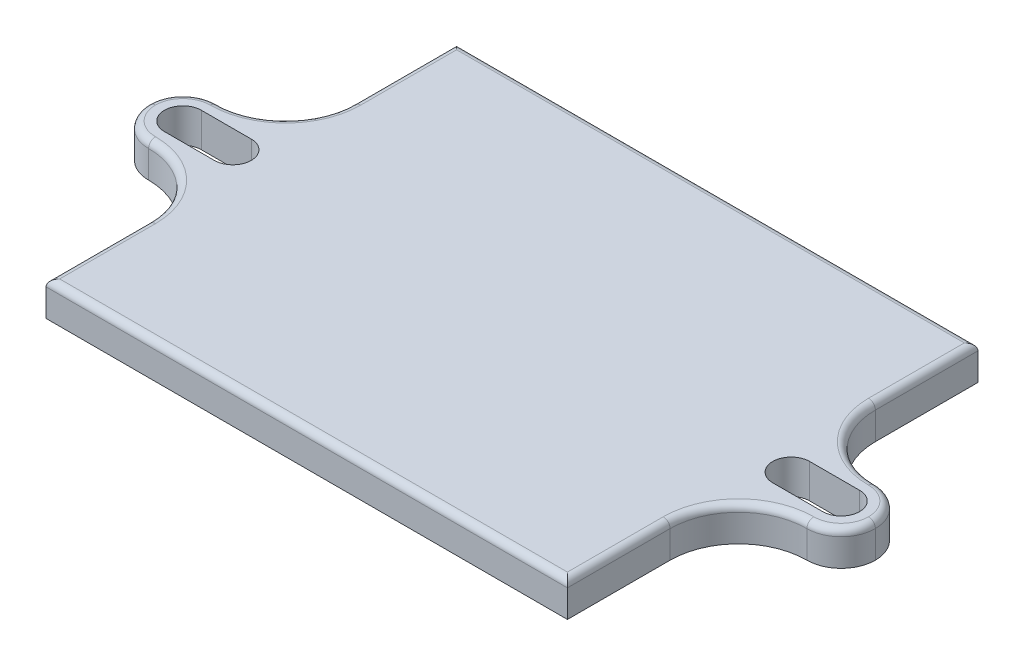
ISO-10303-21;
HEADER;
FILE_DESCRIPTION(('STEP AP214'),'2;1');
FILE_NAME('part.step','',(''),(''),'','','');
FILE_SCHEMA(('AUTOMOTIVE_DESIGN { 1 0 10303 214 1 1 1 1 }'));
ENDSEC;
DATA;
#1=APPLICATION_CONTEXT('core data for automotive mechanical design processes');
#2=APPLICATION_PROTOCOL_DEFINITION('international standard','automotive_design',2000,#1);
#3=PRODUCT_CONTEXT('',#1,'mechanical');
#4=PRODUCT('Part','Part','',(#3));
#5=PRODUCT_RELATED_PRODUCT_CATEGORY('part','',(#4));
#6=PRODUCT_DEFINITION_FORMATION('','',#4);
#7=PRODUCT_DEFINITION_CONTEXT('part definition',#1,'design');
#8=PRODUCT_DEFINITION('design','',#6,#7);
#9=PRODUCT_DEFINITION_SHAPE('','',#8);
#10=(LENGTH_UNIT() NAMED_UNIT(*) SI_UNIT(.MILLI.,.METRE.));
#11=(NAMED_UNIT(*) PLANE_ANGLE_UNIT() SI_UNIT($,.RADIAN.));
#12=(NAMED_UNIT(*) SI_UNIT($,.STERADIAN.) SOLID_ANGLE_UNIT());
#13=UNCERTAINTY_MEASURE_WITH_UNIT(LENGTH_MEASURE(1.E-05),#10,'distance_accuracy_value','');
#14=(GEOMETRIC_REPRESENTATION_CONTEXT(3) GLOBAL_UNCERTAINTY_ASSIGNED_CONTEXT((#13)) GLOBAL_UNIT_ASSIGNED_CONTEXT((#10,
#11,#12)) REPRESENTATION_CONTEXT('',''));
#15=CARTESIAN_POINT('',(0.,0.,0.));
#16=DIRECTION('',(0.,0.,1.));
#17=DIRECTION('',(1.,0.,0.));
#18=AXIS2_PLACEMENT_3D('',#15,#16,#17);
#19=CARTESIAN_POINT('',(0.,2.5,0.));
#20=DIRECTION('',(0.,1.,0.));
#21=DIRECTION('',(0.,0.,1.));
#22=AXIS2_PLACEMENT_3D('',#19,#20,#21);
#23=PLANE('',#22);
#24=DIRECTION('',(0.,0.,-1.));
#25=VECTOR('',#24,1.);
#26=CARTESIAN_POINT('',(37.1,2.5,15.));
#27=LINE('',#26,#25);
#28=CARTESIAN_POINT('',(37.1,2.5,29.));
#29=VERTEX_POINT('',#28);
#30=CARTESIAN_POINT('',(37.1,2.5,15.));
#31=VERTEX_POINT('',#30);
#32=EDGE_CURVE('E381',#29,#31,#27,.T.);
#33=ORIENTED_EDGE('',*,*,#32,.T.);
#34=CARTESIAN_POINT('',(48.1,2.5,15.));
#35=DIRECTION('',(0.,1.,0.));
#36=DIRECTION('',(0.,0.,1.));
#37=AXIS2_PLACEMENT_3D('',#34,#35,#36);
#38=CIRCLE('',#37,11.);
#39=CARTESIAN_POINT('',(48.1,2.5,4.));
#40=VERTEX_POINT('',#39);
#41=EDGE_CURVE('E394',#31,#40,#38,.F.);
#42=ORIENTED_EDGE('',*,*,#41,.T.);
#43=CARTESIAN_POINT('',(48.1,2.5,0.));
#44=DIRECTION('',(0.,1.,0.));
#45=DIRECTION('',(0.,0.,1.));
#46=AXIS2_PLACEMENT_3D('',#43,#44,#45);
#47=CIRCLE('',#46,4.);
#48=CARTESIAN_POINT('',(52.1,2.5,0.));
#49=VERTEX_POINT('',#48);
#50=EDGE_CURVE('E392',#40,#49,#47,.T.);
#51=ORIENTED_EDGE('',*,*,#50,.T.);
#52=CARTESIAN_POINT('',(48.1,2.5,0.));
#53=DIRECTION('',(0.,1.,0.));
#54=DIRECTION('',(0.,0.,1.));
#55=AXIS2_PLACEMENT_3D('',#52,#53,#54);
#56=CIRCLE('',#55,4.);
#57=CARTESIAN_POINT('',(48.1,2.5,-4.));
#58=VERTEX_POINT('',#57);
#59=EDGE_CURVE('E390',#49,#58,#56,.T.);
#60=ORIENTED_EDGE('',*,*,#59,.T.);
#61=CARTESIAN_POINT('',(48.1,2.5,-15.));
#62=DIRECTION('',(0.,1.,0.));
#63=DIRECTION('',(0.,0.,1.));
#64=AXIS2_PLACEMENT_3D('',#61,#62,#63);
#65=CIRCLE('',#64,11.);
#66=CARTESIAN_POINT('',(37.1,2.5,-15.));
#67=VERTEX_POINT('',#66);
#68=EDGE_CURVE('E388',#58,#67,#65,.F.);
#69=ORIENTED_EDGE('',*,*,#68,.T.);
#70=DIRECTION('',(0.,0.,-1.));
#71=VECTOR('',#70,1.);
#72=CARTESIAN_POINT('',(37.1,2.5,-30.));
#73=LINE('',#72,#71);
#74=CARTESIAN_POINT('',(37.1,2.5,-29.));
#75=VERTEX_POINT('',#74);
#76=EDGE_CURVE('E386',#67,#75,#73,.T.);
#77=ORIENTED_EDGE('',*,*,#76,.T.);
#78=DIRECTION('',(-1.,0.,0.));
#79=VECTOR('',#78,1.);
#80=CARTESIAN_POINT('',(-38.1,2.5,-29.));
#81=LINE('',#80,#79);
#82=CARTESIAN_POINT('',(-37.1,2.5,-29.));
#83=VERTEX_POINT('',#82);
#84=EDGE_CURVE('E384',#75,#83,#81,.T.);
#85=ORIENTED_EDGE('',*,*,#84,.T.);
#86=DIRECTION('',(0.,0.,1.));
#87=VECTOR('',#86,1.);
#88=CARTESIAN_POINT('',(-37.1,2.5,-15.));
#89=LINE('',#88,#87);
#90=CARTESIAN_POINT('',(-37.1,2.5,-15.));
#91=VERTEX_POINT('',#90);
#92=EDGE_CURVE('E379',#83,#91,#89,.T.);
#93=ORIENTED_EDGE('',*,*,#92,.T.);
#94=CARTESIAN_POINT('',(-48.1,2.5,-15.));
#95=DIRECTION('',(0.,1.,0.));
#96=DIRECTION('',(0.,0.,1.));
#97=AXIS2_PLACEMENT_3D('',#94,#95,#96);
#98=CIRCLE('',#97,11.);
#99=CARTESIAN_POINT('',(-48.1,2.5,-4.));
#100=VERTEX_POINT('',#99);
#101=EDGE_CURVE('E377',#91,#100,#98,.F.);
#102=ORIENTED_EDGE('',*,*,#101,.T.);
#103=CARTESIAN_POINT('',(-48.1,2.5,0.));
#104=DIRECTION('',(0.,1.,0.));
#105=DIRECTION('',(0.,0.,1.));
#106=AXIS2_PLACEMENT_3D('',#103,#104,#105);
#107=CIRCLE('',#106,4.);
#108=CARTESIAN_POINT('',(-52.1,2.5,0.));
#109=VERTEX_POINT('',#108);
#110=EDGE_CURVE('E375',#100,#109,#107,.T.);
#111=ORIENTED_EDGE('',*,*,#110,.T.);
#112=CARTESIAN_POINT('',(-48.1,2.5,0.));
#113=DIRECTION('',(0.,1.,0.));
#114=DIRECTION('',(0.,0.,1.));
#115=AXIS2_PLACEMENT_3D('',#112,#113,#114);
#116=CIRCLE('',#115,4.);
#117=CARTESIAN_POINT('',(-48.1,2.5,4.));
#118=VERTEX_POINT('',#117);
#119=EDGE_CURVE('E373',#109,#118,#116,.T.);
#120=ORIENTED_EDGE('',*,*,#119,.T.);
#121=CARTESIAN_POINT('',(-48.1,2.5,15.));
#122=DIRECTION('',(0.,1.,0.));
#123=DIRECTION('',(0.,0.,1.));
#124=AXIS2_PLACEMENT_3D('',#121,#122,#123);
#125=CIRCLE('',#124,11.);
#126=CARTESIAN_POINT('',(-37.1,2.5,15.));
#127=VERTEX_POINT('',#126);
#128=EDGE_CURVE('E371',#118,#127,#125,.F.);
#129=ORIENTED_EDGE('',*,*,#128,.T.);
#130=DIRECTION('',(0.,0.,1.));
#131=VECTOR('',#130,1.);
#132=CARTESIAN_POINT('',(-37.1,2.5,30.));
#133=LINE('',#132,#131);
#134=CARTESIAN_POINT('',(-37.1,2.5,29.));
#135=VERTEX_POINT('',#134);
#136=EDGE_CURVE('E369',#127,#135,#133,.T.);
#137=ORIENTED_EDGE('',*,*,#136,.T.);
#138=DIRECTION('',(1.,0.,0.));
#139=VECTOR('',#138,1.);
#140=CARTESIAN_POINT('',(38.1,2.5,29.));
#141=LINE('',#140,#139);
#142=EDGE_CURVE('E362',#135,#29,#141,.T.);
#143=ORIENTED_EDGE('',*,*,#142,.T.);
#144=EDGE_LOOP('',(#33,#42,#51,#60,#69,#77,#85,#93,#102,#111,#120,#129,#137,#143));
#145=FACE_BOUND('',#144,.T.);
#146=CARTESIAN_POINT('',(-48.1,2.5,0.));
#147=DIRECTION('',(0.,1.,0.));
#148=DIRECTION('',(0.,0.,1.));
#149=AXIS2_PLACEMENT_3D('',#146,#147,#148);
#150=CIRCLE('',#149,2.7);
#151=CARTESIAN_POINT('',(-48.1,2.5,-2.7));
#152=VERTEX_POINT('',#151);
#153=CARTESIAN_POINT('',(-48.1,2.5,2.7));
#154=VERTEX_POINT('',#153);
#155=EDGE_CURVE('E259',#152,#154,#150,.T.);
#156=ORIENTED_EDGE('',*,*,#155,.F.);
#157=DIRECTION('',(-1.,0.,0.));
#158=VECTOR('',#157,1.);
#159=CARTESIAN_POINT('',(-48.1,2.5,-2.7));
#160=LINE('',#159,#158);
#161=CARTESIAN_POINT('',(-40.8,2.5,-2.7));
#162=VERTEX_POINT('',#161);
#163=EDGE_CURVE('E269',#162,#152,#160,.T.);
#164=ORIENTED_EDGE('',*,*,#163,.F.);
#165=CARTESIAN_POINT('',(-40.8,2.5,0.));
#166=DIRECTION('',(0.,1.,0.));
#167=DIRECTION('',(0.,0.,-1.));
#168=AXIS2_PLACEMENT_3D('',#165,#166,#167);
#169=CIRCLE('',#168,2.7);
#170=CARTESIAN_POINT('',(-40.8,2.5,2.7));
#171=VERTEX_POINT('',#170);
#172=EDGE_CURVE('E266',#171,#162,#169,.T.);
#173=ORIENTED_EDGE('',*,*,#172,.F.);
#174=DIRECTION('',(1.,0.,0.));
#175=VECTOR('',#174,1.);
#176=CARTESIAN_POINT('',(-48.1,2.5,2.7));
#177=LINE('',#176,#175);
#178=EDGE_CURVE('E263',#154,#171,#177,.T.);
#179=ORIENTED_EDGE('',*,*,#178,.F.);
#180=EDGE_LOOP('',(#156,#164,#173,#179));
#181=FACE_BOUND('',#180,.T.);
#182=DIRECTION('',(1.,0.,0.));
#183=VECTOR('',#182,1.);
#184=CARTESIAN_POINT('',(48.1,2.5,-2.7));
#185=LINE('',#184,#183);
#186=CARTESIAN_POINT('',(40.8,2.5,-2.7));
#187=VERTEX_POINT('',#186);
#188=CARTESIAN_POINT('',(48.1,2.5,-2.7));
#189=VERTEX_POINT('',#188);
#190=EDGE_CURVE('E244',#187,#189,#185,.T.);
#191=ORIENTED_EDGE('',*,*,#190,.T.);
#192=CARTESIAN_POINT('',(48.1,2.5,0.));
#193=DIRECTION('',(0.,-1.,0.));
#194=DIRECTION('',(0.,0.,1.));
#195=AXIS2_PLACEMENT_3D('',#192,#193,#194);
#196=CIRCLE('',#195,2.7);
#197=CARTESIAN_POINT('',(48.1,2.5,2.7));
#198=VERTEX_POINT('',#197);
#199=EDGE_CURVE('E249',#189,#198,#196,.T.);
#200=ORIENTED_EDGE('',*,*,#199,.T.);
#201=DIRECTION('',(-1.,0.,0.));
#202=VECTOR('',#201,1.);
#203=CARTESIAN_POINT('',(48.1,2.5,2.7));
#204=LINE('',#203,#202);
#205=CARTESIAN_POINT('',(40.8,2.5,2.7));
#206=VERTEX_POINT('',#205);
#207=EDGE_CURVE('E252',#198,#206,#204,.T.);
#208=ORIENTED_EDGE('',*,*,#207,.T.);
#209=CARTESIAN_POINT('',(40.8,2.5,0.));
#210=DIRECTION('',(0.,-1.,0.));
#211=DIRECTION('',(0.,0.,-1.));
#212=AXIS2_PLACEMENT_3D('',#209,#210,#211);
#213=CIRCLE('',#212,2.7);
#214=EDGE_CURVE('E233',#206,#187,#213,.T.);
#215=ORIENTED_EDGE('',*,*,#214,.T.);
#216=EDGE_LOOP('',(#191,#200,#208,#215));
#217=FACE_BOUND('',#216,.T.);
#218=ADVANCED_FACE('F35',(#145,#181,#217),#23,.T.);
#219=CARTESIAN_POINT('',(0.,-2.5,0.));
#220=DIRECTION('',(0.,1.,0.));
#221=DIRECTION('',(0.,0.,1.));
#222=AXIS2_PLACEMENT_3D('',#219,#220,#221);
#223=PLANE('',#222);
#224=CARTESIAN_POINT('',(48.1,-2.5,-15.));
#225=DIRECTION('',(0.,1.,0.));
#226=DIRECTION('',(0.,0.,1.));
#227=AXIS2_PLACEMENT_3D('',#224,#225,#226);
#228=CIRCLE('',#227,10.);
#229=CARTESIAN_POINT('',(38.1,-2.5,-15.));
#230=VERTEX_POINT('',#229);
#231=CARTESIAN_POINT('',(48.1,-2.5,-5.));
#232=VERTEX_POINT('',#231);
#233=EDGE_CURVE('E342',#230,#232,#228,.T.);
#234=ORIENTED_EDGE('',*,*,#233,.T.);
#235=CARTESIAN_POINT('',(48.1,-2.5,0.));
#236=DIRECTION('',(0.,1.,0.));
#237=DIRECTION('',(0.,0.,1.));
#238=AXIS2_PLACEMENT_3D('',#235,#236,#237);
#239=CIRCLE('',#238,5.);
#240=CARTESIAN_POINT('',(53.1,-2.5,0.));
#241=VERTEX_POINT('',#240);
#242=EDGE_CURVE('E359',#232,#241,#239,.F.);
#243=ORIENTED_EDGE('',*,*,#242,.T.);
#244=CARTESIAN_POINT('',(48.1,-2.5,0.));
#245=DIRECTION('',(0.,1.,0.));
#246=DIRECTION('',(0.,0.,1.));
#247=AXIS2_PLACEMENT_3D('',#244,#245,#246);
#248=CIRCLE('',#247,5.);
#249=CARTESIAN_POINT('',(48.1,-2.5,5.));
#250=VERTEX_POINT('',#249);
#251=EDGE_CURVE('E356',#241,#250,#248,.F.);
#252=ORIENTED_EDGE('',*,*,#251,.T.);
#253=CARTESIAN_POINT('',(48.1,-2.5,15.));
#254=DIRECTION('',(0.,1.,0.));
#255=DIRECTION('',(0.,0.,1.));
#256=AXIS2_PLACEMENT_3D('',#253,#254,#255);
#257=CIRCLE('',#256,10.);
#258=CARTESIAN_POINT('',(38.1,-2.5,15.));
#259=VERTEX_POINT('',#258);
#260=EDGE_CURVE('E345',#250,#259,#257,.T.);
#261=ORIENTED_EDGE('',*,*,#260,.T.);
#262=DIRECTION('',(0.,0.,-1.));
#263=VECTOR('',#262,1.);
#264=CARTESIAN_POINT('',(38.1,-2.5,-30.));
#265=LINE('',#264,#263);
#266=CARTESIAN_POINT('',(38.1,-2.5,30.));
#267=VERTEX_POINT('',#266);
#268=EDGE_CURVE('E289',#267,#259,#265,.T.);
#269=ORIENTED_EDGE('',*,*,#268,.F.);
#270=DIRECTION('',(1.,0.,0.));
#271=VECTOR('',#270,1.);
#272=CARTESIAN_POINT('',(-38.1,-2.5,30.));
#273=LINE('',#272,#271);
#274=CARTESIAN_POINT('',(-38.1,-2.5,30.));
#275=VERTEX_POINT('',#274);
#276=EDGE_CURVE('E285',#275,#267,#273,.T.);
#277=ORIENTED_EDGE('',*,*,#276,.F.);
#278=DIRECTION('',(0.,0.,1.));
#279=VECTOR('',#278,1.);
#280=CARTESIAN_POINT('',(-38.1,-2.5,-30.));
#281=LINE('',#280,#279);
#282=CARTESIAN_POINT('',(-38.1,-2.5,15.));
#283=VERTEX_POINT('',#282);
#284=EDGE_CURVE('E275',#283,#275,#281,.T.);
#285=ORIENTED_EDGE('',*,*,#284,.F.);
#286=CARTESIAN_POINT('',(-48.1,-2.5,15.));
#287=DIRECTION('',(0.,1.,0.));
#288=DIRECTION('',(0.,0.,1.));
#289=AXIS2_PLACEMENT_3D('',#286,#287,#288);
#290=CIRCLE('',#289,10.);
#291=CARTESIAN_POINT('',(-48.1,-2.5,5.));
#292=VERTEX_POINT('',#291);
#293=EDGE_CURVE('E349',#283,#292,#290,.T.);
#294=ORIENTED_EDGE('',*,*,#293,.T.);
#295=CARTESIAN_POINT('',(-48.1,-2.5,0.));
#296=DIRECTION('',(0.,1.,0.));
#297=DIRECTION('',(0.,0.,1.));
#298=AXIS2_PLACEMENT_3D('',#295,#296,#297);
#299=CIRCLE('',#298,5.);
#300=CARTESIAN_POINT('',(-53.1,-2.5,0.));
#301=VERTEX_POINT('',#300);
#302=EDGE_CURVE('E351',#292,#301,#299,.F.);
#303=ORIENTED_EDGE('',*,*,#302,.T.);
#304=CARTESIAN_POINT('',(-48.1,-2.5,0.));
#305=DIRECTION('',(0.,1.,0.));
#306=DIRECTION('',(0.,0.,1.));
#307=AXIS2_PLACEMENT_3D('',#304,#305,#306);
#308=CIRCLE('',#307,5.);
#309=CARTESIAN_POINT('',(-48.1,-2.5,-5.));
#310=VERTEX_POINT('',#309);
#311=EDGE_CURVE('E353',#301,#310,#308,.F.);
#312=ORIENTED_EDGE('',*,*,#311,.T.);
#313=CARTESIAN_POINT('',(-48.1,-2.5,-15.));
#314=DIRECTION('',(0.,1.,0.));
#315=DIRECTION('',(0.,0.,1.));
#316=AXIS2_PLACEMENT_3D('',#313,#314,#315);
#317=CIRCLE('',#316,10.);
#318=CARTESIAN_POINT('',(-38.1,-2.5,-15.));
#319=VERTEX_POINT('',#318);
#320=EDGE_CURVE('E347',#310,#319,#317,.T.);
#321=ORIENTED_EDGE('',*,*,#320,.T.);
#322=CARTESIAN_POINT('',(-38.1,-2.5,-30.));
#323=VERTEX_POINT('',#322);
#324=EDGE_CURVE('E282',#323,#319,#281,.T.);
#325=ORIENTED_EDGE('',*,*,#324,.F.);
#326=DIRECTION('',(-1.,0.,0.));
#327=VECTOR('',#326,1.);
#328=CARTESIAN_POINT('',(-38.1,-2.5,-30.));
#329=LINE('',#328,#327);
#330=CARTESIAN_POINT('',(38.1,-2.5,-30.));
#331=VERTEX_POINT('',#330);
#332=EDGE_CURVE('E292',#331,#323,#329,.T.);
#333=ORIENTED_EDGE('',*,*,#332,.F.);
#334=EDGE_CURVE('E288',#230,#331,#265,.T.);
#335=ORIENTED_EDGE('',*,*,#334,.F.);
#336=EDGE_LOOP('',(#234,#243,#252,#261,#269,#277,#285,#294,#303,#312,#321,#325,#333,#335));
#337=FACE_BOUND('',#336,.T.);
#338=DIRECTION('',(-1.,0.,0.));
#339=VECTOR('',#338,1.);
#340=CARTESIAN_POINT('',(0.,-2.5,-2.7));
#341=LINE('',#340,#339);
#342=CARTESIAN_POINT('',(-40.8,-2.5,-2.7));
#343=VERTEX_POINT('',#342);
#344=CARTESIAN_POINT('',(-48.1,-2.5,-2.7));
#345=VERTEX_POINT('',#344);
#346=EDGE_CURVE('E309',#343,#345,#341,.T.);
#347=ORIENTED_EDGE('',*,*,#346,.T.);
#348=CARTESIAN_POINT('',(-48.1,-2.5,0.));
#349=DIRECTION('',(0.,1.,0.));
#350=DIRECTION('',(0.,0.,1.));
#351=AXIS2_PLACEMENT_3D('',#348,#349,#350);
#352=CIRCLE('',#351,2.7);
#353=CARTESIAN_POINT('',(-48.1,-2.5,2.7));
#354=VERTEX_POINT('',#353);
#355=EDGE_CURVE('E312',#345,#354,#352,.T.);
#356=ORIENTED_EDGE('',*,*,#355,.T.);
#357=DIRECTION('',(1.,0.,0.));
#358=VECTOR('',#357,1.);
#359=CARTESIAN_POINT('',(0.,-2.5,2.7));
#360=LINE('',#359,#358);
#361=CARTESIAN_POINT('',(-40.8,-2.5,2.7));
#362=VERTEX_POINT('',#361);
#363=EDGE_CURVE('E303',#354,#362,#360,.T.);
#364=ORIENTED_EDGE('',*,*,#363,.T.);
#365=CARTESIAN_POINT('',(-40.8,-2.5,0.));
#366=DIRECTION('',(0.,1.,0.));
#367=DIRECTION('',(0.,0.,1.));
#368=AXIS2_PLACEMENT_3D('',#365,#366,#367);
#369=CIRCLE('',#368,2.7);
#370=EDGE_CURVE('E306',#362,#343,#369,.T.);
#371=ORIENTED_EDGE('',*,*,#370,.T.);
#372=EDGE_LOOP('',(#347,#356,#364,#371));
#373=FACE_BOUND('',#372,.T.);
#374=CARTESIAN_POINT('',(48.1,-2.5,0.));
#375=DIRECTION('',(0.,1.,0.));
#376=DIRECTION('',(0.,0.,1.));
#377=AXIS2_PLACEMENT_3D('',#374,#375,#376);
#378=CIRCLE('',#377,2.7);
#379=CARTESIAN_POINT('',(48.1,-2.5,-2.7));
#380=VERTEX_POINT('',#379);
#381=CARTESIAN_POINT('',(48.1,-2.5,2.7));
#382=VERTEX_POINT('',#381);
#383=EDGE_CURVE('E320',#380,#382,#378,.F.);
#384=ORIENTED_EDGE('',*,*,#383,.F.);
#385=DIRECTION('',(1.,0.,0.));
#386=VECTOR('',#385,1.);
#387=CARTESIAN_POINT('',(0.,-2.5,-2.7));
#388=LINE('',#387,#386);
#389=CARTESIAN_POINT('',(40.8,-2.5,-2.7));
#390=VERTEX_POINT('',#389);
#391=EDGE_CURVE('E315',#390,#380,#388,.T.);
#392=ORIENTED_EDGE('',*,*,#391,.F.);
#393=CARTESIAN_POINT('',(40.8,-2.5,0.));
#394=DIRECTION('',(0.,1.,0.));
#395=DIRECTION('',(0.,0.,1.));
#396=AXIS2_PLACEMENT_3D('',#393,#394,#395);
#397=CIRCLE('',#396,2.7);
#398=CARTESIAN_POINT('',(40.8,-2.5,2.7));
#399=VERTEX_POINT('',#398);
#400=EDGE_CURVE('E236',#399,#390,#397,.F.);
#401=ORIENTED_EDGE('',*,*,#400,.F.);
#402=DIRECTION('',(-1.,0.,0.));
#403=VECTOR('',#402,1.);
#404=CARTESIAN_POINT('',(0.,-2.5,2.7));
#405=LINE('',#404,#403);
#406=EDGE_CURVE('E318',#382,#399,#405,.T.);
#407=ORIENTED_EDGE('',*,*,#406,.F.);
#408=EDGE_LOOP('',(#384,#392,#401,#407));
#409=FACE_BOUND('',#408,.T.);
#410=ADVANCED_FACE('F478',(#337,#373,#409),#223,.F.);
#411=CARTESIAN_POINT('',(38.1,2.5,-30.));
#412=DIRECTION('',(-1.,0.,0.));
#413=DIRECTION('',(0.,0.,1.));
#414=AXIS2_PLACEMENT_3D('',#411,#412,#413);
#415=PLANE('',#414);
#416=DIRECTION('',(0.,-1.,0.));
#417=VECTOR('',#416,1.);
#418=CARTESIAN_POINT('',(38.1,2.5,15.));
#419=LINE('',#418,#417);
#420=CARTESIAN_POINT('',(38.1,1.5,15.));
#421=VERTEX_POINT('',#420);
#422=EDGE_CURVE('E329',#259,#421,#419,.F.);
#423=ORIENTED_EDGE('',*,*,#422,.T.);
#424=DIRECTION('',(0.,0.,-1.));
#425=VECTOR('',#424,1.);
#426=CARTESIAN_POINT('',(38.1,1.5,30.));
#427=LINE('',#426,#425);
#428=CARTESIAN_POINT('',(38.1,1.5,30.));
#429=VERTEX_POINT('',#428);
#430=EDGE_CURVE('E396',#421,#429,#427,.F.);
#431=ORIENTED_EDGE('',*,*,#430,.T.);
#432=DIRECTION('',(0.,-1.,0.));
#433=VECTOR('',#432,1.);
#434=CARTESIAN_POINT('',(38.1,2.5,30.));
#435=LINE('',#434,#433);
#436=EDGE_CURVE('E299',#429,#267,#435,.T.);
#437=ORIENTED_EDGE('',*,*,#436,.T.);
#438=ORIENTED_EDGE('',*,*,#268,.T.);
#439=EDGE_LOOP('',(#423,#431,#437,#438));
#440=FACE_BOUND('',#439,.T.);
#441=ADVANCED_FACE('F550',(#440),#415,.F.);
#442=CARTESIAN_POINT('',(-38.1,2.5,-30.));
#443=DIRECTION('',(1.,0.,0.));
#444=DIRECTION('',(0.,0.,-1.));
#445=AXIS2_PLACEMENT_3D('',#442,#443,#444);
#446=PLANE('',#445);
#447=DIRECTION('',(0.,-1.,0.));
#448=VECTOR('',#447,1.);
#449=CARTESIAN_POINT('',(-38.1,2.5,-15.));
#450=LINE('',#449,#448);
#451=CARTESIAN_POINT('',(-38.1,1.5,-15.));
#452=VERTEX_POINT('',#451);
#453=EDGE_CURVE('E334',#319,#452,#450,.F.);
#454=ORIENTED_EDGE('',*,*,#453,.T.);
#455=DIRECTION('',(0.,0.,1.));
#456=VECTOR('',#455,1.);
#457=CARTESIAN_POINT('',(-38.1,1.5,-30.));
#458=LINE('',#457,#456);
#459=CARTESIAN_POINT('',(-38.1,1.5,-30.));
#460=VERTEX_POINT('',#459);
#461=EDGE_CURVE('E407',#452,#460,#458,.F.);
#462=ORIENTED_EDGE('',*,*,#461,.T.);
#463=DIRECTION('',(0.,-1.,0.));
#464=VECTOR('',#463,1.);
#465=CARTESIAN_POINT('',(-38.1,2.5,-30.));
#466=LINE('',#465,#464);
#467=EDGE_CURVE('E295',#460,#323,#466,.T.);
#468=ORIENTED_EDGE('',*,*,#467,.T.);
#469=ORIENTED_EDGE('',*,*,#324,.T.);
#470=EDGE_LOOP('',(#454,#462,#468,#469));
#471=FACE_BOUND('',#470,.T.);
#472=ADVANCED_FACE('F470',(#471),#446,.F.);
#473=DIRECTION('',(0.,-1.,0.));
#474=VECTOR('',#473,1.);
#475=CARTESIAN_POINT('',(-38.1,2.5,30.));
#476=LINE('',#475,#474);
#477=CARTESIAN_POINT('',(-38.1,1.5,30.));
#478=VERTEX_POINT('',#477);
#479=EDGE_CURVE('E301',#478,#275,#476,.T.);
#480=ORIENTED_EDGE('',*,*,#479,.F.);
#481=DIRECTION('',(0.,0.,1.));
#482=VECTOR('',#481,1.);
#483=CARTESIAN_POINT('',(-38.1,1.5,15.));
#484=LINE('',#483,#482);
#485=CARTESIAN_POINT('',(-38.1,1.5,15.));
#486=VERTEX_POINT('',#485);
#487=EDGE_CURVE('E44',#478,#486,#484,.F.);
#488=ORIENTED_EDGE('',*,*,#487,.T.);
#489=DIRECTION('',(0.,-1.,0.));
#490=VECTOR('',#489,1.);
#491=CARTESIAN_POINT('',(-38.1,-2.5,15.));
#492=LINE('',#491,#490);
#493=EDGE_CURVE('E337',#486,#283,#492,.T.);
#494=ORIENTED_EDGE('',*,*,#493,.T.);
#495=ORIENTED_EDGE('',*,*,#284,.T.);
#496=EDGE_LOOP('',(#480,#488,#494,#495));
#497=FACE_BOUND('',#496,.T.);
#498=ADVANCED_FACE('F556',(#497),#446,.F.);
#499=CARTESIAN_POINT('',(-38.1,2.5,30.));
#500=DIRECTION('',(0.,0.,-1.));
#501=DIRECTION('',(-1.,0.,0.));
#502=AXIS2_PLACEMENT_3D('',#499,#500,#501);
#503=PLANE('',#502);
#504=ORIENTED_EDGE('',*,*,#436,.F.);
#505=DIRECTION('',(1.,0.,0.));
#506=VECTOR('',#505,1.);
#507=CARTESIAN_POINT('',(-38.1,1.5,30.));
#508=LINE('',#507,#506);
#509=EDGE_CURVE('E11',#429,#478,#508,.F.);
#510=ORIENTED_EDGE('',*,*,#509,.T.);
#511=ORIENTED_EDGE('',*,*,#479,.T.);
#512=ORIENTED_EDGE('',*,*,#276,.T.);
#513=EDGE_LOOP('',(#504,#510,#511,#512));
#514=FACE_BOUND('',#513,.T.);
#515=ADVANCED_FACE('F551',(#514),#503,.F.);
#516=DIRECTION('',(0.,-1.,0.));
#517=VECTOR('',#516,1.);
#518=CARTESIAN_POINT('',(38.1,2.5,-30.));
#519=LINE('',#518,#517);
#520=CARTESIAN_POINT('',(38.1,1.5,-30.));
#521=VERTEX_POINT('',#520);
#522=EDGE_CURVE('E297',#521,#331,#519,.T.);
#523=ORIENTED_EDGE('',*,*,#522,.F.);
#524=DIRECTION('',(0.,0.,-1.));
#525=VECTOR('',#524,1.);
#526=CARTESIAN_POINT('',(38.1,1.5,-15.));
#527=LINE('',#526,#525);
#528=CARTESIAN_POINT('',(38.1,1.5,-15.));
#529=VERTEX_POINT('',#528);
#530=EDGE_CURVE('E417',#521,#529,#527,.F.);
#531=ORIENTED_EDGE('',*,*,#530,.T.);
#532=DIRECTION('',(0.,-1.,0.));
#533=VECTOR('',#532,1.);
#534=CARTESIAN_POINT('',(38.1,2.5,-15.));
#535=LINE('',#534,#533);
#536=EDGE_CURVE('E322',#529,#230,#535,.T.);
#537=ORIENTED_EDGE('',*,*,#536,.T.);
#538=ORIENTED_EDGE('',*,*,#334,.T.);
#539=EDGE_LOOP('',(#523,#531,#537,#538));
#540=FACE_BOUND('',#539,.T.);
#541=ADVANCED_FACE('F518',(#540),#415,.F.);
#542=CARTESIAN_POINT('',(-38.1,2.5,-30.));
#543=DIRECTION('',(0.,0.,1.));
#544=DIRECTION('',(1.,0.,0.));
#545=AXIS2_PLACEMENT_3D('',#542,#543,#544);
#546=PLANE('',#545);
#547=ORIENTED_EDGE('',*,*,#467,.F.);
#548=DIRECTION('',(-1.,0.,0.));
#549=VECTOR('',#548,1.);
#550=CARTESIAN_POINT('',(38.1,1.5,-30.));
#551=LINE('',#550,#549);
#552=EDGE_CURVE('E58',#460,#521,#551,.F.);
#553=ORIENTED_EDGE('',*,*,#552,.T.);
#554=ORIENTED_EDGE('',*,*,#522,.T.);
#555=ORIENTED_EDGE('',*,*,#332,.T.);
#556=EDGE_LOOP('',(#547,#553,#554,#555));
#557=FACE_BOUND('',#556,.T.);
#558=ADVANCED_FACE('F472',(#557),#546,.F.);
#559=CARTESIAN_POINT('',(-48.1,-7.5,0.));
#560=DIRECTION('',(0.,1.,0.));
#561=DIRECTION('',(0.,0.,1.));
#562=AXIS2_PLACEMENT_3D('',#559,#560,#561);
#563=CYLINDRICAL_SURFACE('',#562,2.7);
#564=DIRECTION('',(0.,1.,0.));
#565=VECTOR('',#564,1.);
#566=CARTESIAN_POINT('',(-48.1,-7.5,-2.7));
#567=LINE('',#566,#565);
#568=EDGE_CURVE('E273',#345,#152,#567,.T.);
#569=ORIENTED_EDGE('',*,*,#568,.T.);
#570=ORIENTED_EDGE('',*,*,#155,.T.);
#571=DIRECTION('',(0.,1.,0.));
#572=VECTOR('',#571,1.);
#573=CARTESIAN_POINT('',(-48.1,-7.5,2.7));
#574=LINE('',#573,#572);
#575=EDGE_CURVE('E272',#354,#154,#574,.T.);
#576=ORIENTED_EDGE('',*,*,#575,.F.);
#577=ORIENTED_EDGE('',*,*,#355,.F.);
#578=EDGE_LOOP('',(#569,#570,#576,#577));
#579=FACE_BOUND('',#578,.T.);
#580=ADVANCED_FACE('F586',(#579),#563,.F.);
#581=CARTESIAN_POINT('',(-48.1,-7.5,-2.7));
#582=DIRECTION('',(0.,0.,-1.));
#583=DIRECTION('',(-1.,0.,0.));
#584=AXIS2_PLACEMENT_3D('',#581,#582,#583);
#585=PLANE('',#584);
#586=DIRECTION('',(0.,1.,0.));
#587=VECTOR('',#586,1.);
#588=CARTESIAN_POINT('',(-40.8,-7.5,-2.7));
#589=LINE('',#588,#587);
#590=EDGE_CURVE('E276',#343,#162,#589,.T.);
#591=ORIENTED_EDGE('',*,*,#590,.T.);
#592=ORIENTED_EDGE('',*,*,#163,.T.);
#593=ORIENTED_EDGE('',*,*,#568,.F.);
#594=ORIENTED_EDGE('',*,*,#346,.F.);
#595=EDGE_LOOP('',(#591,#592,#593,#594));
#596=FACE_BOUND('',#595,.T.);
#597=ADVANCED_FACE('F870',(#596),#585,.F.);
#598=CARTESIAN_POINT('',(-40.8,-7.5,0.));
#599=DIRECTION('',(0.,1.,0.));
#600=DIRECTION('',(0.,0.,1.));
#601=AXIS2_PLACEMENT_3D('',#598,#599,#600);
#602=CYLINDRICAL_SURFACE('',#601,2.7);
#603=DIRECTION('',(0.,1.,0.));
#604=VECTOR('',#603,1.);
#605=CARTESIAN_POINT('',(-40.8,-7.5,2.7));
#606=LINE('',#605,#604);
#607=EDGE_CURVE('E278',#362,#171,#606,.T.);
#608=ORIENTED_EDGE('',*,*,#607,.T.);
#609=ORIENTED_EDGE('',*,*,#172,.T.);
#610=ORIENTED_EDGE('',*,*,#590,.F.);
#611=ORIENTED_EDGE('',*,*,#370,.F.);
#612=EDGE_LOOP('',(#608,#609,#610,#611));
#613=FACE_BOUND('',#612,.T.);
#614=ADVANCED_FACE('F861',(#613),#602,.F.);
#615=CARTESIAN_POINT('',(-48.1,-7.5,2.7));
#616=DIRECTION('',(0.,0.,1.));
#617=DIRECTION('',(1.,0.,0.));
#618=AXIS2_PLACEMENT_3D('',#615,#616,#617);
#619=PLANE('',#618);
#620=ORIENTED_EDGE('',*,*,#575,.T.);
#621=ORIENTED_EDGE('',*,*,#178,.T.);
#622=ORIENTED_EDGE('',*,*,#607,.F.);
#623=ORIENTED_EDGE('',*,*,#363,.F.);
#624=EDGE_LOOP('',(#620,#621,#622,#623));
#625=FACE_BOUND('',#624,.T.);
#626=ADVANCED_FACE('F852',(#625),#619,.F.);
#627=CARTESIAN_POINT('',(48.1,-7.5,0.));
#628=DIRECTION('',(0.,1.,0.));
#629=DIRECTION('',(0.,0.,1.));
#630=AXIS2_PLACEMENT_3D('',#627,#628,#629);
#631=CYLINDRICAL_SURFACE('',#630,2.7);
#632=ORIENTED_EDGE('',*,*,#383,.T.);
#633=DIRECTION('',(0.,1.,0.));
#634=VECTOR('',#633,1.);
#635=CARTESIAN_POINT('',(48.1,-7.5,2.7));
#636=LINE('',#635,#634);
#637=EDGE_CURVE('E257',#382,#198,#636,.T.);
#638=ORIENTED_EDGE('',*,*,#637,.T.);
#639=ORIENTED_EDGE('',*,*,#199,.F.);
#640=DIRECTION('',(0.,1.,0.));
#641=VECTOR('',#640,1.);
#642=CARTESIAN_POINT('',(48.1,-7.5,-2.7));
#643=LINE('',#642,#641);
#644=EDGE_CURVE('E240',#380,#189,#643,.T.);
#645=ORIENTED_EDGE('',*,*,#644,.F.);
#646=EDGE_LOOP('',(#632,#638,#639,#645));
#647=FACE_BOUND('',#646,.T.);
#648=ADVANCED_FACE('F843',(#647),#631,.F.);
#649=CARTESIAN_POINT('',(48.1,-7.5,2.7));
#650=DIRECTION('',(0.,0.,-1.));
#651=DIRECTION('',(-1.,0.,0.));
#652=AXIS2_PLACEMENT_3D('',#649,#650,#651);
#653=PLANE('',#652);
#654=ORIENTED_EDGE('',*,*,#406,.T.);
#655=DIRECTION('',(0.,1.,0.));
#656=VECTOR('',#655,1.);
#657=CARTESIAN_POINT('',(40.8,-7.5,2.7));
#658=LINE('',#657,#656);
#659=EDGE_CURVE('E239',#399,#206,#658,.T.);
#660=ORIENTED_EDGE('',*,*,#659,.T.);
#661=ORIENTED_EDGE('',*,*,#207,.F.);
#662=ORIENTED_EDGE('',*,*,#637,.F.);
#663=EDGE_LOOP('',(#654,#660,#661,#662));
#664=FACE_BOUND('',#663,.T.);
#665=ADVANCED_FACE('F834',(#664),#653,.T.);
#666=CARTESIAN_POINT('',(40.8,-7.5,0.));
#667=DIRECTION('',(0.,1.,0.));
#668=DIRECTION('',(0.,0.,1.));
#669=AXIS2_PLACEMENT_3D('',#666,#667,#668);
#670=CYLINDRICAL_SURFACE('',#669,2.7);
#671=ORIENTED_EDGE('',*,*,#400,.T.);
#672=DIRECTION('',(0.,1.,0.));
#673=VECTOR('',#672,1.);
#674=CARTESIAN_POINT('',(40.8,-7.5,-2.7));
#675=LINE('',#674,#673);
#676=EDGE_CURVE('E228',#390,#187,#675,.T.);
#677=ORIENTED_EDGE('',*,*,#676,.T.);
#678=ORIENTED_EDGE('',*,*,#214,.F.);
#679=ORIENTED_EDGE('',*,*,#659,.F.);
#680=EDGE_LOOP('',(#671,#677,#678,#679));
#681=FACE_BOUND('',#680,.T.);
#682=ADVANCED_FACE('F230',(#681),#670,.F.);
#683=CARTESIAN_POINT('',(48.1,-7.5,-2.7));
#684=DIRECTION('',(0.,0.,1.));
#685=DIRECTION('',(1.,0.,0.));
#686=AXIS2_PLACEMENT_3D('',#683,#684,#685);
#687=PLANE('',#686);
#688=ORIENTED_EDGE('',*,*,#391,.T.);
#689=ORIENTED_EDGE('',*,*,#644,.T.);
#690=ORIENTED_EDGE('',*,*,#190,.F.);
#691=ORIENTED_EDGE('',*,*,#676,.F.);
#692=EDGE_LOOP('',(#688,#689,#690,#691));
#693=FACE_BOUND('',#692,.T.);
#694=ADVANCED_FACE('F245',(#693),#687,.T.);
#695=CARTESIAN_POINT('',(48.1,2.5,-15.));
#696=DIRECTION('',(0.,-1.,0.));
#697=DIRECTION('',(0.,0.,-1.));
#698=AXIS2_PLACEMENT_3D('',#695,#696,#697);
#699=CYLINDRICAL_SURFACE('',#698,10.);
#700=ORIENTED_EDGE('',*,*,#536,.F.);
#701=CARTESIAN_POINT('',(48.1,1.5,-15.));
#702=DIRECTION('',(0.,1.,0.));
#703=DIRECTION('',(0.,0.,1.));
#704=AXIS2_PLACEMENT_3D('',#701,#702,#703);
#705=CIRCLE('',#704,10.);
#706=CARTESIAN_POINT('',(48.1,1.5,-5.));
#707=VERTEX_POINT('',#706);
#708=EDGE_CURVE('E405',#529,#707,#705,.T.);
#709=ORIENTED_EDGE('',*,*,#708,.T.);
#710=DIRECTION('',(0.,-1.,0.));
#711=VECTOR('',#710,1.);
#712=CARTESIAN_POINT('',(48.1,2.5,-5.));
#713=LINE('',#712,#711);
#714=EDGE_CURVE('E324',#232,#707,#713,.F.);
#715=ORIENTED_EDGE('',*,*,#714,.F.);
#716=ORIENTED_EDGE('',*,*,#233,.F.);
#717=EDGE_LOOP('',(#700,#709,#715,#716));
#718=FACE_BOUND('',#717,.T.);
#719=ADVANCED_FACE('F521',(#718),#699,.F.);
#720=CARTESIAN_POINT('',(48.1,2.5,15.));
#721=DIRECTION('',(0.,-1.,0.));
#722=DIRECTION('',(0.,0.,-1.));
#723=AXIS2_PLACEMENT_3D('',#720,#721,#722);
#724=CYLINDRICAL_SURFACE('',#723,10.);
#725=DIRECTION('',(0.,-1.,0.));
#726=VECTOR('',#725,1.);
#727=CARTESIAN_POINT('',(48.1,2.5,5.));
#728=LINE('',#727,#726);
#729=CARTESIAN_POINT('',(48.1,1.5,5.));
#730=VERTEX_POINT('',#729);
#731=EDGE_CURVE('E327',#730,#250,#728,.T.);
#732=ORIENTED_EDGE('',*,*,#731,.F.);
#733=CARTESIAN_POINT('',(48.1,1.5,15.));
#734=DIRECTION('',(0.,1.,0.));
#735=DIRECTION('',(0.,0.,1.));
#736=AXIS2_PLACEMENT_3D('',#733,#734,#735);
#737=CIRCLE('',#736,10.);
#738=EDGE_CURVE('E399',#730,#421,#737,.T.);
#739=ORIENTED_EDGE('',*,*,#738,.T.);
#740=ORIENTED_EDGE('',*,*,#422,.F.);
#741=ORIENTED_EDGE('',*,*,#260,.F.);
#742=EDGE_LOOP('',(#732,#739,#740,#741));
#743=FACE_BOUND('',#742,.T.);
#744=ADVANCED_FACE('F534',(#743),#724,.F.);
#745=CARTESIAN_POINT('',(-48.1,2.5,-15.));
#746=DIRECTION('',(0.,1.,0.));
#747=DIRECTION('',(0.,0.,1.));
#748=AXIS2_PLACEMENT_3D('',#745,#746,#747);
#749=CYLINDRICAL_SURFACE('',#748,10.);
#750=DIRECTION('',(0.,-1.,0.));
#751=VECTOR('',#750,1.);
#752=CARTESIAN_POINT('',(-48.1,-2.5,-5.));
#753=LINE('',#752,#751);
#754=CARTESIAN_POINT('',(-48.1,1.5,-5.));
#755=VERTEX_POINT('',#754);
#756=EDGE_CURVE('E332',#755,#310,#753,.T.);
#757=ORIENTED_EDGE('',*,*,#756,.F.);
#758=CARTESIAN_POINT('',(-48.1,1.5,-15.));
#759=DIRECTION('',(0.,1.,0.));
#760=DIRECTION('',(0.,0.,1.));
#761=AXIS2_PLACEMENT_3D('',#758,#759,#760);
#762=CIRCLE('',#761,10.);
#763=EDGE_CURVE('E409',#755,#452,#762,.T.);
#764=ORIENTED_EDGE('',*,*,#763,.T.);
#765=ORIENTED_EDGE('',*,*,#453,.F.);
#766=ORIENTED_EDGE('',*,*,#320,.F.);
#767=EDGE_LOOP('',(#757,#764,#765,#766));
#768=FACE_BOUND('',#767,.T.);
#769=ADVANCED_FACE('F483',(#768),#749,.F.);
#770=CARTESIAN_POINT('',(-48.1,2.5,15.));
#771=DIRECTION('',(0.,1.,0.));
#772=DIRECTION('',(0.,0.,1.));
#773=AXIS2_PLACEMENT_3D('',#770,#771,#772);
#774=CYLINDRICAL_SURFACE('',#773,10.);
#775=ORIENTED_EDGE('',*,*,#493,.F.);
#776=CARTESIAN_POINT('',(-48.1,1.5,15.));
#777=DIRECTION('',(0.,1.,0.));
#778=DIRECTION('',(0.,0.,1.));
#779=AXIS2_PLACEMENT_3D('',#776,#777,#778);
#780=CIRCLE('',#779,10.);
#781=CARTESIAN_POINT('',(-48.1,1.5,5.));
#782=VERTEX_POINT('',#781);
#783=EDGE_CURVE('E415',#486,#782,#780,.T.);
#784=ORIENTED_EDGE('',*,*,#783,.T.);
#785=DIRECTION('',(0.,-1.,0.));
#786=VECTOR('',#785,1.);
#787=CARTESIAN_POINT('',(-48.1,2.5,5.));
#788=LINE('',#787,#786);
#789=EDGE_CURVE('E339',#292,#782,#788,.F.);
#790=ORIENTED_EDGE('',*,*,#789,.F.);
#791=ORIENTED_EDGE('',*,*,#293,.F.);
#792=EDGE_LOOP('',(#775,#784,#790,#791));
#793=FACE_BOUND('',#792,.T.);
#794=ADVANCED_FACE('F561',(#793),#774,.F.);
#795=CARTESIAN_POINT('',(48.1,2.5,0.));
#796=DIRECTION('',(0.,-1.,0.));
#797=DIRECTION('',(0.,0.,-1.));
#798=AXIS2_PLACEMENT_3D('',#795,#796,#797);
#799=CYLINDRICAL_SURFACE('',#798,5.);
#800=DIRECTION('',(0.,-1.,0.));
#801=VECTOR('',#800,1.);
#802=CARTESIAN_POINT('',(53.1,2.5,0.));
#803=LINE('',#802,#801);
#804=CARTESIAN_POINT('',(53.1,1.5,0.));
#805=VERTEX_POINT('',#804);
#806=EDGE_CURVE('E363',#805,#241,#803,.T.);
#807=ORIENTED_EDGE('',*,*,#806,.F.);
#808=CARTESIAN_POINT('',(48.1,1.5,0.));
#809=DIRECTION('',(0.,1.,0.));
#810=DIRECTION('',(0.,0.,1.));
#811=AXIS2_PLACEMENT_3D('',#808,#809,#810);
#812=CIRCLE('',#811,5.);
#813=EDGE_CURVE('E401',#805,#730,#812,.F.);
#814=ORIENTED_EDGE('',*,*,#813,.T.);
#815=ORIENTED_EDGE('',*,*,#731,.T.);
#816=ORIENTED_EDGE('',*,*,#251,.F.);
#817=EDGE_LOOP('',(#807,#814,#815,#816));
#818=FACE_BOUND('',#817,.T.);
#819=ADVANCED_FACE('F528',(#818),#799,.T.);
#820=CARTESIAN_POINT('',(48.1,2.5,0.));
#821=DIRECTION('',(0.,-1.,0.));
#822=DIRECTION('',(0.,0.,-1.));
#823=AXIS2_PLACEMENT_3D('',#820,#821,#822);
#824=CYLINDRICAL_SURFACE('',#823,5.);
#825=ORIENTED_EDGE('',*,*,#714,.T.);
#826=CARTESIAN_POINT('',(48.1,1.5,0.));
#827=DIRECTION('',(0.,1.,0.));
#828=DIRECTION('',(0.,0.,1.));
#829=AXIS2_PLACEMENT_3D('',#826,#827,#828);
#830=CIRCLE('',#829,5.);
#831=EDGE_CURVE('E403',#707,#805,#830,.F.);
#832=ORIENTED_EDGE('',*,*,#831,.T.);
#833=ORIENTED_EDGE('',*,*,#806,.T.);
#834=ORIENTED_EDGE('',*,*,#242,.F.);
#835=EDGE_LOOP('',(#825,#832,#833,#834));
#836=FACE_BOUND('',#835,.T.);
#837=ADVANCED_FACE('F605',(#836),#824,.T.);
#838=CARTESIAN_POINT('',(-48.1,2.5,0.));
#839=DIRECTION('',(0.,-1.,0.));
#840=DIRECTION('',(0.,0.,-1.));
#841=AXIS2_PLACEMENT_3D('',#838,#839,#840);
#842=CYLINDRICAL_SURFACE('',#841,5.);
#843=ORIENTED_EDGE('',*,*,#789,.T.);
#844=CARTESIAN_POINT('',(-48.1,1.5,0.));
#845=DIRECTION('',(0.,1.,0.));
#846=DIRECTION('',(0.,0.,1.));
#847=AXIS2_PLACEMENT_3D('',#844,#845,#846);
#848=CIRCLE('',#847,5.);
#849=CARTESIAN_POINT('',(-53.1,1.5,0.));
#850=VERTEX_POINT('',#849);
#851=EDGE_CURVE('E413',#782,#850,#848,.F.);
#852=ORIENTED_EDGE('',*,*,#851,.T.);
#853=DIRECTION('',(0.,-1.,0.));
#854=VECTOR('',#853,1.);
#855=CARTESIAN_POINT('',(-53.1,2.5,0.));
#856=LINE('',#855,#854);
#857=EDGE_CURVE('E365',#301,#850,#856,.F.);
#858=ORIENTED_EDGE('',*,*,#857,.F.);
#859=ORIENTED_EDGE('',*,*,#302,.F.);
#860=EDGE_LOOP('',(#843,#852,#858,#859));
#861=FACE_BOUND('',#860,.T.);
#862=ADVANCED_FACE('F494',(#861),#842,.T.);
#863=CARTESIAN_POINT('',(-48.1,2.5,0.));
#864=DIRECTION('',(0.,-1.,0.));
#865=DIRECTION('',(0.,0.,-1.));
#866=AXIS2_PLACEMENT_3D('',#863,#864,#865);
#867=CYLINDRICAL_SURFACE('',#866,5.);
#868=ORIENTED_EDGE('',*,*,#857,.T.);
#869=CARTESIAN_POINT('',(-48.1,1.5,0.));
#870=DIRECTION('',(0.,1.,0.));
#871=DIRECTION('',(0.,0.,1.));
#872=AXIS2_PLACEMENT_3D('',#869,#870,#871);
#873=CIRCLE('',#872,5.);
#874=EDGE_CURVE('E411',#850,#755,#873,.F.);
#875=ORIENTED_EDGE('',*,*,#874,.T.);
#876=ORIENTED_EDGE('',*,*,#756,.T.);
#877=ORIENTED_EDGE('',*,*,#311,.F.);
#878=EDGE_LOOP('',(#868,#875,#876,#877));
#879=FACE_BOUND('',#878,.T.);
#880=ADVANCED_FACE('F486',(#879),#867,.T.);
#881=CARTESIAN_POINT('',(-37.1,1.5,0.));
#882=DIRECTION('',(0.,0.,-1.));
#883=DIRECTION('',(-1.,0.,0.));
#884=AXIS2_PLACEMENT_3D('',#881,#882,#883);
#885=CYLINDRICAL_SURFACE('',#884,1.);
#886=CARTESIAN_POINT('',(-37.1,1.5,-29.));
#887=DIRECTION('',(0.707106781186547,0.,-0.707106781186548));
#888=DIRECTION('',(0.707106781186548,0.,0.707106781186547));
#889=AXIS2_PLACEMENT_3D('',#886,#887,#888);
#890=ELLIPSE('',#889,1.4142135623731,1.);
#891=EDGE_CURVE('E454',#460,#83,#890,.T.);
#892=ORIENTED_EDGE('',*,*,#891,.F.);
#893=ORIENTED_EDGE('',*,*,#461,.F.);
#894=CARTESIAN_POINT('',(-37.1,1.5,-15.));
#895=DIRECTION('',(0.,0.,1.));
#896=DIRECTION('',(1.,0.,0.));
#897=AXIS2_PLACEMENT_3D('',#894,#895,#896);
#898=CIRCLE('',#897,1.);
#899=EDGE_CURVE('E39',#91,#452,#898,.T.);
#900=ORIENTED_EDGE('',*,*,#899,.F.);
#901=ORIENTED_EDGE('',*,*,#92,.F.);
#902=EDGE_LOOP('',(#892,#893,#900,#901));
#903=FACE_BOUND('',#902,.T.);
#904=ADVANCED_FACE('F37',(#903),#885,.T.);
#905=CARTESIAN_POINT('',(-48.1,1.5,-15.));
#906=DIRECTION('',(0.,1.,0.));
#907=DIRECTION('',(0.,0.,1.));
#908=AXIS2_PLACEMENT_3D('',#905,#906,#907);
#909=TOROIDAL_SURFACE('',#908,11.,1.);
#910=ORIENTED_EDGE('',*,*,#899,.T.);
#911=ORIENTED_EDGE('',*,*,#763,.F.);
#912=CARTESIAN_POINT('',(-48.1,1.5,-4.));
#913=DIRECTION('',(-1.,0.,0.));
#914=DIRECTION('',(0.,0.,1.));
#915=AXIS2_PLACEMENT_3D('',#912,#913,#914);
#916=CIRCLE('',#915,1.);
#917=EDGE_CURVE('E452',#100,#755,#916,.T.);
#918=ORIENTED_EDGE('',*,*,#917,.F.);
#919=ORIENTED_EDGE('',*,*,#101,.F.);
#920=EDGE_LOOP('',(#910,#911,#918,#919));
#921=FACE_BOUND('',#920,.T.);
#922=ADVANCED_FACE('F464',(#921),#909,.T.);
#923=CARTESIAN_POINT('',(0.,1.5,-29.));
#924=DIRECTION('',(1.,0.,0.));
#925=DIRECTION('',(0.,0.,-1.));
#926=AXIS2_PLACEMENT_3D('',#923,#924,#925);
#927=CYLINDRICAL_SURFACE('',#926,1.);
#928=ORIENTED_EDGE('',*,*,#891,.T.);
#929=ORIENTED_EDGE('',*,*,#84,.F.);
#930=CARTESIAN_POINT('',(37.1,1.5,-29.));
#931=DIRECTION('',(0.707106781186547,0.,0.707106781186547));
#932=DIRECTION('',(0.707106781186547,0.,-0.707106781186547));
#933=AXIS2_PLACEMENT_3D('',#930,#931,#932);
#934=ELLIPSE('',#933,1.41421356237309,1.);
#935=EDGE_CURVE('E449',#521,#75,#934,.T.);
#936=ORIENTED_EDGE('',*,*,#935,.F.);
#937=ORIENTED_EDGE('',*,*,#552,.F.);
#938=EDGE_LOOP('',(#928,#929,#936,#937));
#939=FACE_BOUND('',#938,.T.);
#940=ADVANCED_FACE('F510',(#939),#927,.T.);
#941=CARTESIAN_POINT('',(-48.1,1.5,0.));
#942=DIRECTION('',(0.,1.,0.));
#943=DIRECTION('',(0.,0.,1.));
#944=AXIS2_PLACEMENT_3D('',#941,#942,#943);
#945=TOROIDAL_SURFACE('',#944,4.,1.);
#946=ORIENTED_EDGE('',*,*,#917,.T.);
#947=ORIENTED_EDGE('',*,*,#874,.F.);
#948=CARTESIAN_POINT('',(-52.1,1.5,0.));
#949=DIRECTION('',(0.,0.,1.));
#950=DIRECTION('',(1.,0.,0.));
#951=AXIS2_PLACEMENT_3D('',#948,#949,#950);
#952=CIRCLE('',#951,1.);
#953=EDGE_CURVE('E446',#109,#850,#952,.T.);
#954=ORIENTED_EDGE('',*,*,#953,.F.);
#955=ORIENTED_EDGE('',*,*,#110,.F.);
#956=EDGE_LOOP('',(#946,#947,#954,#955));
#957=FACE_BOUND('',#956,.T.);
#958=ADVANCED_FACE('F498',(#957),#945,.T.);
#959=CARTESIAN_POINT('',(37.1,1.5,0.));
#960=DIRECTION('',(0.,0.,1.));
#961=DIRECTION('',(1.,0.,0.));
#962=AXIS2_PLACEMENT_3D('',#959,#960,#961);
#963=CYLINDRICAL_SURFACE('',#962,1.);
#964=ORIENTED_EDGE('',*,*,#935,.T.);
#965=ORIENTED_EDGE('',*,*,#76,.F.);
#966=CARTESIAN_POINT('',(37.1,1.5,-15.));
#967=DIRECTION('',(0.,0.,1.));
#968=DIRECTION('',(1.,0.,0.));
#969=AXIS2_PLACEMENT_3D('',#966,#967,#968);
#970=CIRCLE('',#969,1.);
#971=EDGE_CURVE('E443',#529,#67,#970,.T.);
#972=ORIENTED_EDGE('',*,*,#971,.F.);
#973=ORIENTED_EDGE('',*,*,#530,.F.);
#974=EDGE_LOOP('',(#964,#965,#972,#973));
#975=FACE_BOUND('',#974,.T.);
#976=ADVANCED_FACE('F513',(#975),#963,.T.);
#977=CARTESIAN_POINT('',(-48.1,1.5,0.));
#978=DIRECTION('',(0.,1.,0.));
#979=DIRECTION('',(0.,0.,1.));
#980=AXIS2_PLACEMENT_3D('',#977,#978,#979);
#981=TOROIDAL_SURFACE('',#980,4.,1.);
#982=ORIENTED_EDGE('',*,*,#953,.T.);
#983=ORIENTED_EDGE('',*,*,#851,.F.);
#984=CARTESIAN_POINT('',(-48.1,1.5,4.));
#985=DIRECTION('',(1.,0.,0.));
#986=DIRECTION('',(0.,0.,-1.));
#987=AXIS2_PLACEMENT_3D('',#984,#985,#986);
#988=CIRCLE('',#987,1.);
#989=EDGE_CURVE('E440',#118,#782,#988,.T.);
#990=ORIENTED_EDGE('',*,*,#989,.F.);
#991=ORIENTED_EDGE('',*,*,#119,.F.);
#992=EDGE_LOOP('',(#982,#983,#990,#991));
#993=FACE_BOUND('',#992,.T.);
#994=ADVANCED_FACE('F502',(#993),#981,.T.);
#995=CARTESIAN_POINT('',(48.1,1.5,-15.));
#996=DIRECTION('',(0.,1.,0.));
#997=DIRECTION('',(0.,0.,1.));
#998=AXIS2_PLACEMENT_3D('',#995,#996,#997);
#999=TOROIDAL_SURFACE('',#998,11.,1.);
#1000=ORIENTED_EDGE('',*,*,#971,.T.);
#1001=ORIENTED_EDGE('',*,*,#68,.F.);
#1002=CARTESIAN_POINT('',(48.1,1.5,-4.));
#1003=DIRECTION('',(1.,0.,0.));
#1004=DIRECTION('',(0.,1.,0.));
#1005=AXIS2_PLACEMENT_3D('',#1002,#1003,#1004);
#1006=CIRCLE('',#1005,1.);
#1007=EDGE_CURVE('E437',#707,#58,#1006,.T.);
#1008=ORIENTED_EDGE('',*,*,#1007,.F.);
#1009=ORIENTED_EDGE('',*,*,#708,.F.);
#1010=EDGE_LOOP('',(#1000,#1001,#1008,#1009));
#1011=FACE_BOUND('',#1010,.T.);
#1012=ADVANCED_FACE('F658',(#1011),#999,.T.);
#1013=CARTESIAN_POINT('',(-48.1,1.5,15.));
#1014=DIRECTION('',(0.,1.,0.));
#1015=DIRECTION('',(0.,0.,1.));
#1016=AXIS2_PLACEMENT_3D('',#1013,#1014,#1015);
#1017=TOROIDAL_SURFACE('',#1016,11.,1.);
#1018=ORIENTED_EDGE('',*,*,#989,.T.);
#1019=ORIENTED_EDGE('',*,*,#783,.F.);
#1020=CARTESIAN_POINT('',(-37.1,1.5,15.));
#1021=DIRECTION('',(0.,0.,1.));
#1022=DIRECTION('',(1.,0.,0.));
#1023=AXIS2_PLACEMENT_3D('',#1020,#1021,#1022);
#1024=CIRCLE('',#1023,1.);
#1025=EDGE_CURVE('E434',#127,#486,#1024,.T.);
#1026=ORIENTED_EDGE('',*,*,#1025,.F.);
#1027=ORIENTED_EDGE('',*,*,#128,.F.);
#1028=EDGE_LOOP('',(#1018,#1019,#1026,#1027));
#1029=FACE_BOUND('',#1028,.T.);
#1030=ADVANCED_FACE('F563',(#1029),#1017,.T.);
#1031=CARTESIAN_POINT('',(48.1,1.5,0.));
#1032=DIRECTION('',(0.,1.,0.));
#1033=DIRECTION('',(0.,0.,1.));
#1034=AXIS2_PLACEMENT_3D('',#1031,#1032,#1033);
#1035=TOROIDAL_SURFACE('',#1034,4.,1.);
#1036=ORIENTED_EDGE('',*,*,#1007,.T.);
#1037=ORIENTED_EDGE('',*,*,#59,.F.);
#1038=CARTESIAN_POINT('',(52.1,1.5,0.));
#1039=DIRECTION('',(0.,0.,1.));
#1040=DIRECTION('',(0.,-1.,0.));
#1041=AXIS2_PLACEMENT_3D('',#1038,#1039,#1040);
#1042=CIRCLE('',#1041,1.);
#1043=EDGE_CURVE('E431',#805,#49,#1042,.T.);
#1044=ORIENTED_EDGE('',*,*,#1043,.F.);
#1045=ORIENTED_EDGE('',*,*,#831,.F.);
#1046=EDGE_LOOP('',(#1036,#1037,#1044,#1045));
#1047=FACE_BOUND('',#1046,.T.);
#1048=ADVANCED_FACE('F640',(#1047),#1035,.T.);
#1049=CARTESIAN_POINT('',(-37.1,1.5,0.));
#1050=DIRECTION('',(0.,0.,-1.));
#1051=DIRECTION('',(-1.,0.,0.));
#1052=AXIS2_PLACEMENT_3D('',#1049,#1050,#1051);
#1053=CYLINDRICAL_SURFACE('',#1052,1.);
#1054=ORIENTED_EDGE('',*,*,#1025,.T.);
#1055=ORIENTED_EDGE('',*,*,#487,.F.);
#1056=CARTESIAN_POINT('',(-37.1,1.5,29.));
#1057=DIRECTION('',(-0.707106781186548,0.,-0.707106781186547));
#1058=DIRECTION('',(-0.707106781186547,0.,0.707106781186548));
#1059=AXIS2_PLACEMENT_3D('',#1056,#1057,#1058);
#1060=ELLIPSE('',#1059,1.41421356237309,1.);
#1061=EDGE_CURVE('E428',#135,#478,#1060,.F.);
#1062=ORIENTED_EDGE('',*,*,#1061,.F.);
#1063=ORIENTED_EDGE('',*,*,#136,.F.);
#1064=EDGE_LOOP('',(#1054,#1055,#1062,#1063));
#1065=FACE_BOUND('',#1064,.T.);
#1066=ADVANCED_FACE('F566',(#1065),#1053,.T.);
#1067=CARTESIAN_POINT('',(48.1,1.5,0.));
#1068=DIRECTION('',(0.,1.,0.));
#1069=DIRECTION('',(0.,0.,1.));
#1070=AXIS2_PLACEMENT_3D('',#1067,#1068,#1069);
#1071=TOROIDAL_SURFACE('',#1070,4.,1.);
#1072=ORIENTED_EDGE('',*,*,#1043,.T.);
#1073=ORIENTED_EDGE('',*,*,#50,.F.);
#1074=CARTESIAN_POINT('',(48.1,1.5,4.));
#1075=DIRECTION('',(-1.,0.,0.));
#1076=DIRECTION('',(0.,0.,1.));
#1077=AXIS2_PLACEMENT_3D('',#1074,#1075,#1076);
#1078=CIRCLE('',#1077,1.);
#1079=EDGE_CURVE('E425',#730,#40,#1078,.T.);
#1080=ORIENTED_EDGE('',*,*,#1079,.F.);
#1081=ORIENTED_EDGE('',*,*,#813,.F.);
#1082=EDGE_LOOP('',(#1072,#1073,#1080,#1081));
#1083=FACE_BOUND('',#1082,.T.);
#1084=ADVANCED_FACE('F539',(#1083),#1071,.T.);
#1085=CARTESIAN_POINT('',(0.,1.5,29.));
#1086=DIRECTION('',(-1.,0.,0.));
#1087=DIRECTION('',(0.,0.,1.));
#1088=AXIS2_PLACEMENT_3D('',#1085,#1086,#1087);
#1089=CYLINDRICAL_SURFACE('',#1088,1.);
#1090=ORIENTED_EDGE('',*,*,#1061,.T.);
#1091=ORIENTED_EDGE('',*,*,#509,.F.);
#1092=CARTESIAN_POINT('',(37.1,1.5,29.));
#1093=DIRECTION('',(-0.707106781186547,0.,0.707106781186547));
#1094=DIRECTION('',(-0.707106781186547,0.,-0.707106781186547));
#1095=AXIS2_PLACEMENT_3D('',#1092,#1093,#1094);
#1096=ELLIPSE('',#1095,1.41421356237309,1.);
#1097=EDGE_CURVE('E423',#29,#429,#1096,.F.);
#1098=ORIENTED_EDGE('',*,*,#1097,.F.);
#1099=ORIENTED_EDGE('',*,*,#142,.F.);
#1100=EDGE_LOOP('',(#1090,#1091,#1098,#1099));
#1101=FACE_BOUND('',#1100,.T.);
#1102=ADVANCED_FACE('F570',(#1101),#1089,.T.);
#1103=CARTESIAN_POINT('',(48.1,1.5,15.));
#1104=DIRECTION('',(0.,1.,0.));
#1105=DIRECTION('',(0.,0.,1.));
#1106=AXIS2_PLACEMENT_3D('',#1103,#1104,#1105);
#1107=TOROIDAL_SURFACE('',#1106,11.,1.);
#1108=ORIENTED_EDGE('',*,*,#1079,.T.);
#1109=ORIENTED_EDGE('',*,*,#41,.F.);
#1110=CARTESIAN_POINT('',(37.1,1.5,15.));
#1111=DIRECTION('',(0.,0.,1.));
#1112=DIRECTION('',(1.,0.,0.));
#1113=AXIS2_PLACEMENT_3D('',#1110,#1111,#1112);
#1114=CIRCLE('',#1113,1.);
#1115=EDGE_CURVE('E421',#421,#31,#1114,.T.);
#1116=ORIENTED_EDGE('',*,*,#1115,.F.);
#1117=ORIENTED_EDGE('',*,*,#738,.F.);
#1118=EDGE_LOOP('',(#1108,#1109,#1116,#1117));
#1119=FACE_BOUND('',#1118,.T.);
#1120=ADVANCED_FACE('F543',(#1119),#1107,.T.);
#1121=CARTESIAN_POINT('',(37.1,1.5,0.));
#1122=DIRECTION('',(0.,0.,1.));
#1123=DIRECTION('',(1.,0.,0.));
#1124=AXIS2_PLACEMENT_3D('',#1121,#1122,#1123);
#1125=CYLINDRICAL_SURFACE('',#1124,1.);
#1126=ORIENTED_EDGE('',*,*,#1097,.T.);
#1127=ORIENTED_EDGE('',*,*,#430,.F.);
#1128=ORIENTED_EDGE('',*,*,#1115,.T.);
#1129=ORIENTED_EDGE('',*,*,#32,.F.);
#1130=EDGE_LOOP('',(#1126,#1127,#1128,#1129));
#1131=FACE_BOUND('',#1130,.T.);
#1132=ADVANCED_FACE('F547',(#1131),#1125,.T.);
#1133=CLOSED_SHELL('',(#218,#410,#441,#472,#498,#515,#541,#558,#580,#597,#614,#626,#648,#665,
#682,#694,#719,#744,#769,#794,#819,#837,#862,#880,#904,#922,#940,#958,#976,#994,#1012,#1030,
#1048,#1066,#1084,#1102,#1120,#1132));
#1134=MANIFOLD_SOLID_BREP('B2',#1133);
#1135=ADVANCED_BREP_SHAPE_REPRESENTATION('',(#18,#1134),#14);
#1136=SHAPE_DEFINITION_REPRESENTATION(#9,#1135);
ENDSEC;
END-ISO-10303-21;
